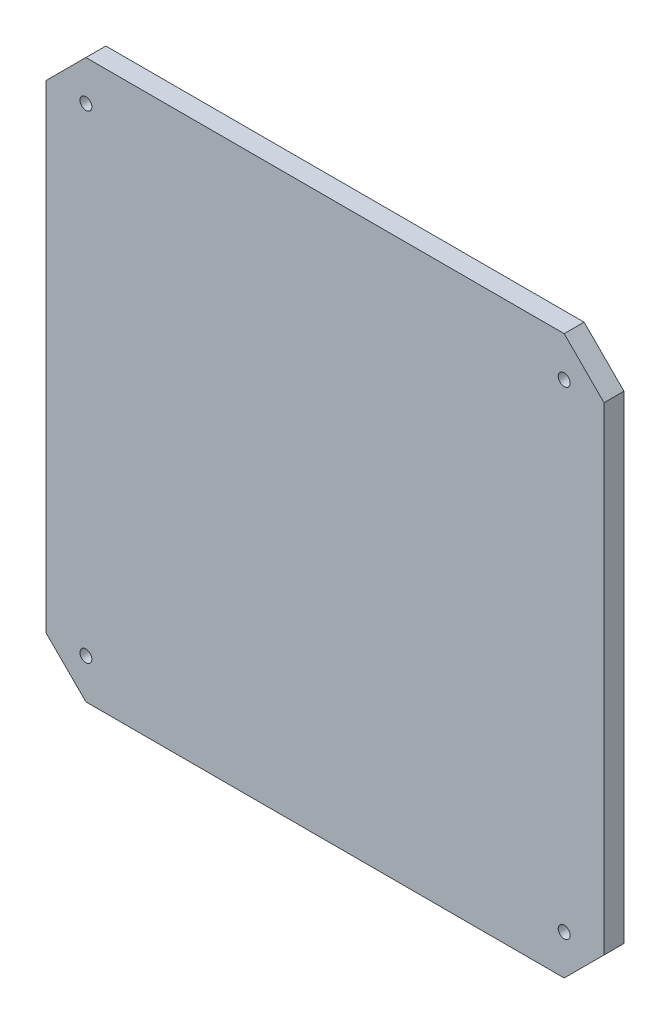
ISO-10303-21;
HEADER;
FILE_DESCRIPTION(('STEP AP214'),'2;1');
FILE_NAME('part.step','',(''),(''),'','','');
FILE_SCHEMA(('AUTOMOTIVE_DESIGN { 1 0 10303 214 1 1 1 1 }'));
ENDSEC;
DATA;
#1=APPLICATION_CONTEXT('core data for automotive mechanical design processes');
#2=APPLICATION_PROTOCOL_DEFINITION('international standard','automotive_design',2000,#1);
#3=PRODUCT_CONTEXT('',#1,'mechanical');
#4=PRODUCT('Part','Part','',(#3));
#5=PRODUCT_RELATED_PRODUCT_CATEGORY('part','',(#4));
#6=PRODUCT_DEFINITION_FORMATION('','',#4);
#7=PRODUCT_DEFINITION_CONTEXT('part definition',#1,'design');
#8=PRODUCT_DEFINITION('design','',#6,#7);
#9=PRODUCT_DEFINITION_SHAPE('','',#8);
#10=(LENGTH_UNIT() NAMED_UNIT(*) SI_UNIT(.MILLI.,.METRE.));
#11=(NAMED_UNIT(*) PLANE_ANGLE_UNIT() SI_UNIT($,.RADIAN.));
#12=(NAMED_UNIT(*) SI_UNIT($,.STERADIAN.) SOLID_ANGLE_UNIT());
#13=UNCERTAINTY_MEASURE_WITH_UNIT(LENGTH_MEASURE(1.E-05),#10,'distance_accuracy_value','');
#14=(GEOMETRIC_REPRESENTATION_CONTEXT(3) GLOBAL_UNCERTAINTY_ASSIGNED_CONTEXT((#13)) GLOBAL_UNIT_ASSIGNED_CONTEXT((#10,
#11,#12)) REPRESENTATION_CONTEXT('',''));
#15=CARTESIAN_POINT('',(0.,0.,0.));
#16=DIRECTION('',(0.,0.,1.));
#17=DIRECTION('',(1.,0.,0.));
#18=AXIS2_PLACEMENT_3D('',#15,#16,#17);
#19=CARTESIAN_POINT('',(0.,0.,12.7));
#20=DIRECTION('',(0.,0.,-1.));
#21=DIRECTION('',(-1.,0.,0.));
#22=AXIS2_PLACEMENT_3D('',#19,#20,#21);
#23=PLANE('',#22);
#24=DIRECTION('',(-1.,0.,0.));
#25=VECTOR('',#24,1.);
#26=CARTESIAN_POINT('',(-152.4,177.8,12.7));
#27=LINE('',#26,#25);
#28=CARTESIAN_POINT('',(152.4,177.8,12.7));
#29=VERTEX_POINT('',#28);
#30=CARTESIAN_POINT('',(-152.4,177.8,12.7));
#31=VERTEX_POINT('',#30);
#32=EDGE_CURVE('E153',#29,#31,#27,.T.);
#33=ORIENTED_EDGE('',*,*,#32,.T.);
#34=DIRECTION('',(-0.707106781186547,-0.707106781186548,0.));
#35=VECTOR('',#34,1.);
#36=CARTESIAN_POINT('',(-177.8,152.4,12.7));
#37=LINE('',#36,#35);
#38=CARTESIAN_POINT('',(-177.8,152.4,12.7));
#39=VERTEX_POINT('',#38);
#40=EDGE_CURVE('E102',#31,#39,#37,.T.);
#41=ORIENTED_EDGE('',*,*,#40,.T.);
#42=DIRECTION('',(0.,-1.,0.));
#43=VECTOR('',#42,1.);
#44=CARTESIAN_POINT('',(-177.8,152.4,12.7));
#45=LINE('',#44,#43);
#46=CARTESIAN_POINT('',(-177.8,-152.4,12.7));
#47=VERTEX_POINT('',#46);
#48=EDGE_CURVE('E166',#39,#47,#45,.T.);
#49=ORIENTED_EDGE('',*,*,#48,.T.);
#50=DIRECTION('',(0.707106781186547,-0.707106781186548,0.));
#51=VECTOR('',#50,1.);
#52=CARTESIAN_POINT('',(-177.8,-152.4,12.7));
#53=LINE('',#52,#51);
#54=CARTESIAN_POINT('',(-152.4,-177.8,12.7));
#55=VERTEX_POINT('',#54);
#56=EDGE_CURVE('E181',#47,#55,#53,.T.);
#57=ORIENTED_EDGE('',*,*,#56,.T.);
#58=DIRECTION('',(1.,0.,0.));
#59=VECTOR('',#58,1.);
#60=CARTESIAN_POINT('',(-152.4,-177.8,12.7));
#61=LINE('',#60,#59);
#62=CARTESIAN_POINT('',(152.4,-177.8,12.7));
#63=VERTEX_POINT('',#62);
#64=EDGE_CURVE('E116',#55,#63,#61,.T.);
#65=ORIENTED_EDGE('',*,*,#64,.T.);
#66=DIRECTION('',(0.707106781186547,0.707106781186548,0.));
#67=VECTOR('',#66,1.);
#68=CARTESIAN_POINT('',(152.4,-177.8,12.7));
#69=LINE('',#68,#67);
#70=CARTESIAN_POINT('',(177.8,-152.4,12.7));
#71=VERTEX_POINT('',#70);
#72=EDGE_CURVE('E114',#63,#71,#69,.T.);
#73=ORIENTED_EDGE('',*,*,#72,.T.);
#74=DIRECTION('',(0.,1.,0.));
#75=VECTOR('',#74,1.);
#76=CARTESIAN_POINT('',(177.8,152.4,12.7));
#77=LINE('',#76,#75);
#78=CARTESIAN_POINT('',(177.8,152.4,12.7));
#79=VERTEX_POINT('',#78);
#80=EDGE_CURVE('E118',#71,#79,#77,.T.);
#81=ORIENTED_EDGE('',*,*,#80,.T.);
#82=DIRECTION('',(-0.707106781186547,0.707106781186548,0.));
#83=VECTOR('',#82,1.);
#84=CARTESIAN_POINT('',(152.4,177.8,12.7));
#85=LINE('',#84,#83);
#86=EDGE_CURVE('E59',#79,#29,#85,.T.);
#87=ORIENTED_EDGE('',*,*,#86,.T.);
#88=EDGE_LOOP('',(#33,#41,#49,#57,#65,#73,#81,#87));
#89=FACE_BOUND('',#88,.T.);
#90=CARTESIAN_POINT('',(-152.4,152.4,12.7));
#91=DIRECTION('',(0.,0.,1.));
#92=DIRECTION('',(1.,0.,0.));
#93=AXIS2_PLACEMENT_3D('',#90,#91,#92);
#94=CIRCLE('',#93,3.81000000000002);
#95=CARTESIAN_POINT('',(-148.59,152.4,12.7));
#96=VERTEX_POINT('',#95);
#97=EDGE_CURVE('E145',#96,#96,#94,.T.);
#98=ORIENTED_EDGE('',*,*,#97,.F.);
#99=EDGE_LOOP('',(#98));
#100=FACE_BOUND('',#99,.T.);
#101=CARTESIAN_POINT('',(152.4,152.4,12.7));
#102=DIRECTION('',(0.,0.,1.));
#103=DIRECTION('',(1.,0.,0.));
#104=AXIS2_PLACEMENT_3D('',#101,#102,#103);
#105=CIRCLE('',#104,3.81000000000002);
#106=CARTESIAN_POINT('',(156.21,152.4,12.7));
#107=VERTEX_POINT('',#106);
#108=EDGE_CURVE('E189',#107,#107,#105,.T.);
#109=ORIENTED_EDGE('',*,*,#108,.F.);
#110=EDGE_LOOP('',(#109));
#111=FACE_BOUND('',#110,.T.);
#112=CARTESIAN_POINT('',(152.4,-152.4,12.7));
#113=DIRECTION('',(0.,0.,1.));
#114=DIRECTION('',(1.,0.,0.));
#115=AXIS2_PLACEMENT_3D('',#112,#113,#114);
#116=CIRCLE('',#115,3.81000000000002);
#117=CARTESIAN_POINT('',(156.21,-152.4,12.7));
#118=VERTEX_POINT('',#117);
#119=EDGE_CURVE('E197',#118,#118,#116,.T.);
#120=ORIENTED_EDGE('',*,*,#119,.F.);
#121=EDGE_LOOP('',(#120));
#122=FACE_BOUND('',#121,.T.);
#123=CARTESIAN_POINT('',(-152.4,-152.4,12.7));
#124=DIRECTION('',(0.,0.,1.));
#125=DIRECTION('',(1.,0.,0.));
#126=AXIS2_PLACEMENT_3D('',#123,#124,#125);
#127=CIRCLE('',#126,3.81000000000002);
#128=CARTESIAN_POINT('',(-148.59,-152.4,12.7));
#129=VERTEX_POINT('',#128);
#130=EDGE_CURVE('E205',#129,#129,#127,.T.);
#131=ORIENTED_EDGE('',*,*,#130,.F.);
#132=EDGE_LOOP('',(#131));
#133=FACE_BOUND('',#132,.T.);
#134=ADVANCED_FACE('F41',(#89,#100,#111,#122,#133),#23,.F.);
#135=CARTESIAN_POINT('',(0.,0.,0.));
#136=DIRECTION('',(0.,0.,-1.));
#137=DIRECTION('',(-1.,0.,0.));
#138=AXIS2_PLACEMENT_3D('',#135,#136,#137);
#139=PLANE('',#138);
#140=CARTESIAN_POINT('',(152.4,-152.4,0.));
#141=DIRECTION('',(0.,0.,1.));
#142=DIRECTION('',(1.,0.,0.));
#143=AXIS2_PLACEMENT_3D('',#140,#141,#142);
#144=CIRCLE('',#143,3.81000000000002);
#145=CARTESIAN_POINT('',(156.21,-152.4,0.));
#146=VERTEX_POINT('',#145);
#147=EDGE_CURVE('E199',#146,#146,#144,.T.);
#148=ORIENTED_EDGE('',*,*,#147,.T.);
#149=EDGE_LOOP('',(#148));
#150=FACE_BOUND('',#149,.T.);
#151=CARTESIAN_POINT('',(-152.4,152.4,0.));
#152=DIRECTION('',(0.,0.,1.));
#153=DIRECTION('',(1.,0.,0.));
#154=AXIS2_PLACEMENT_3D('',#151,#152,#153);
#155=CIRCLE('',#154,3.81000000000002);
#156=CARTESIAN_POINT('',(-148.59,152.4,0.));
#157=VERTEX_POINT('',#156);
#158=EDGE_CURVE('E190',#157,#157,#155,.T.);
#159=ORIENTED_EDGE('',*,*,#158,.T.);
#160=EDGE_LOOP('',(#159));
#161=FACE_BOUND('',#160,.T.);
#162=DIRECTION('',(-1.,0.,0.));
#163=VECTOR('',#162,1.);
#164=CARTESIAN_POINT('',(-152.4,177.8,0.));
#165=LINE('',#164,#163);
#166=CARTESIAN_POINT('',(152.4,177.8,0.));
#167=VERTEX_POINT('',#166);
#168=CARTESIAN_POINT('',(-152.4,177.8,0.));
#169=VERTEX_POINT('',#168);
#170=EDGE_CURVE('E138',#167,#169,#165,.T.);
#171=ORIENTED_EDGE('',*,*,#170,.F.);
#172=DIRECTION('',(-0.707106781186547,0.707106781186548,0.));
#173=VECTOR('',#172,1.);
#174=CARTESIAN_POINT('',(152.4,177.8,0.));
#175=LINE('',#174,#173);
#176=CARTESIAN_POINT('',(177.8,152.4,0.));
#177=VERTEX_POINT('',#176);
#178=EDGE_CURVE('E93',#177,#167,#175,.T.);
#179=ORIENTED_EDGE('',*,*,#178,.F.);
#180=DIRECTION('',(0.,1.,0.));
#181=VECTOR('',#180,1.);
#182=CARTESIAN_POINT('',(177.8,152.4,0.));
#183=LINE('',#182,#181);
#184=CARTESIAN_POINT('',(177.8,-152.4,0.));
#185=VERTEX_POINT('',#184);
#186=EDGE_CURVE('E90',#185,#177,#183,.T.);
#187=ORIENTED_EDGE('',*,*,#186,.F.);
#188=DIRECTION('',(0.707106781186547,0.707106781186548,0.));
#189=VECTOR('',#188,1.);
#190=CARTESIAN_POINT('',(152.4,-177.8,0.));
#191=LINE('',#190,#189);
#192=CARTESIAN_POINT('',(152.4,-177.8,0.));
#193=VERTEX_POINT('',#192);
#194=EDGE_CURVE('E126',#193,#185,#191,.T.);
#195=ORIENTED_EDGE('',*,*,#194,.F.);
#196=DIRECTION('',(1.,0.,0.));
#197=VECTOR('',#196,1.);
#198=CARTESIAN_POINT('',(-152.4,-177.8,0.));
#199=LINE('',#198,#197);
#200=CARTESIAN_POINT('',(-152.4,-177.8,0.));
#201=VERTEX_POINT('',#200);
#202=EDGE_CURVE('E149',#201,#193,#199,.T.);
#203=ORIENTED_EDGE('',*,*,#202,.F.);
#204=DIRECTION('',(0.707106781186547,-0.707106781186548,0.));
#205=VECTOR('',#204,1.);
#206=CARTESIAN_POINT('',(-177.8,-152.4,0.));
#207=LINE('',#206,#205);
#208=CARTESIAN_POINT('',(-177.8,-152.4,0.));
#209=VERTEX_POINT('',#208);
#210=EDGE_CURVE('E147',#209,#201,#207,.T.);
#211=ORIENTED_EDGE('',*,*,#210,.F.);
#212=DIRECTION('',(0.,-1.,0.));
#213=VECTOR('',#212,1.);
#214=CARTESIAN_POINT('',(-177.8,152.4,0.));
#215=LINE('',#214,#213);
#216=CARTESIAN_POINT('',(-177.8,152.4,0.));
#217=VERTEX_POINT('',#216);
#218=EDGE_CURVE('E143',#217,#209,#215,.T.);
#219=ORIENTED_EDGE('',*,*,#218,.F.);
#220=DIRECTION('',(-0.707106781186547,-0.707106781186548,0.));
#221=VECTOR('',#220,1.);
#222=CARTESIAN_POINT('',(-177.8,152.4,0.));
#223=LINE('',#222,#221);
#224=EDGE_CURVE('E141',#169,#217,#223,.T.);
#225=ORIENTED_EDGE('',*,*,#224,.F.);
#226=EDGE_LOOP('',(#171,#179,#187,#195,#203,#211,#219,#225));
#227=FACE_BOUND('',#226,.T.);
#228=CARTESIAN_POINT('',(152.4,152.4,0.));
#229=DIRECTION('',(0.,0.,1.));
#230=DIRECTION('',(1.,0.,0.));
#231=AXIS2_PLACEMENT_3D('',#228,#229,#230);
#232=CIRCLE('',#231,3.81000000000002);
#233=CARTESIAN_POINT('',(156.21,152.4,0.));
#234=VERTEX_POINT('',#233);
#235=EDGE_CURVE('E194',#234,#234,#232,.T.);
#236=ORIENTED_EDGE('',*,*,#235,.T.);
#237=EDGE_LOOP('',(#236));
#238=FACE_BOUND('',#237,.T.);
#239=CARTESIAN_POINT('',(-152.4,-152.4,0.));
#240=DIRECTION('',(0.,0.,1.));
#241=DIRECTION('',(1.,0.,0.));
#242=AXIS2_PLACEMENT_3D('',#239,#240,#241);
#243=CIRCLE('',#242,3.81000000000002);
#244=CARTESIAN_POINT('',(-148.59,-152.4,0.));
#245=VERTEX_POINT('',#244);
#246=EDGE_CURVE('E203',#245,#245,#243,.T.);
#247=ORIENTED_EDGE('',*,*,#246,.T.);
#248=EDGE_LOOP('',(#247));
#249=FACE_BOUND('',#248,.T.);
#250=ADVANCED_FACE('F175',(#150,#161,#227,#238,#249),#139,.T.);
#251=CARTESIAN_POINT('',(-152.4,177.8,12.7));
#252=DIRECTION('',(0.,-1.,0.));
#253=DIRECTION('',(0.,0.,-1.));
#254=AXIS2_PLACEMENT_3D('',#251,#252,#253);
#255=PLANE('',#254);
#256=ORIENTED_EDGE('',*,*,#170,.T.);
#257=DIRECTION('',(0.,0.,-1.));
#258=VECTOR('',#257,1.);
#259=CARTESIAN_POINT('',(-152.4,177.8,12.7));
#260=LINE('',#259,#258);
#261=EDGE_CURVE('E11',#31,#169,#260,.T.);
#262=ORIENTED_EDGE('',*,*,#261,.F.);
#263=ORIENTED_EDGE('',*,*,#32,.F.);
#264=DIRECTION('',(0.,0.,-1.));
#265=VECTOR('',#264,1.);
#266=CARTESIAN_POINT('',(152.4,177.8,12.7));
#267=LINE('',#266,#265);
#268=EDGE_CURVE('E132',#29,#167,#267,.T.);
#269=ORIENTED_EDGE('',*,*,#268,.T.);
#270=EDGE_LOOP('',(#256,#262,#263,#269));
#271=FACE_BOUND('',#270,.T.);
#272=ADVANCED_FACE('F43',(#271),#255,.F.);
#273=CARTESIAN_POINT('',(-177.8,152.4,12.7));
#274=DIRECTION('',(0.707106781186548,-0.707106781186547,0.));
#275=DIRECTION('',(0.707106781186547,0.707106781186548,0.));
#276=AXIS2_PLACEMENT_3D('',#273,#274,#275);
#277=PLANE('',#276);
#278=ORIENTED_EDGE('',*,*,#224,.T.);
#279=DIRECTION('',(0.,0.,-1.));
#280=VECTOR('',#279,1.);
#281=CARTESIAN_POINT('',(-177.8,152.4,12.7));
#282=LINE('',#281,#280);
#283=EDGE_CURVE('E49',#39,#217,#282,.T.);
#284=ORIENTED_EDGE('',*,*,#283,.F.);
#285=ORIENTED_EDGE('',*,*,#40,.F.);
#286=ORIENTED_EDGE('',*,*,#261,.T.);
#287=EDGE_LOOP('',(#278,#284,#285,#286));
#288=FACE_BOUND('',#287,.T.);
#289=ADVANCED_FACE('F240',(#288),#277,.F.);
#290=CARTESIAN_POINT('',(-177.8,152.4,12.7));
#291=DIRECTION('',(1.,0.,0.));
#292=DIRECTION('',(0.,1.,0.));
#293=AXIS2_PLACEMENT_3D('',#290,#291,#292);
#294=PLANE('',#293);
#295=ORIENTED_EDGE('',*,*,#218,.T.);
#296=DIRECTION('',(0.,0.,-1.));
#297=VECTOR('',#296,1.);
#298=CARTESIAN_POINT('',(-177.8,-152.4,12.7));
#299=LINE('',#298,#297);
#300=EDGE_CURVE('E158',#47,#209,#299,.T.);
#301=ORIENTED_EDGE('',*,*,#300,.F.);
#302=ORIENTED_EDGE('',*,*,#48,.F.);
#303=ORIENTED_EDGE('',*,*,#283,.T.);
#304=EDGE_LOOP('',(#295,#301,#302,#303));
#305=FACE_BOUND('',#304,.T.);
#306=ADVANCED_FACE('F168',(#305),#294,.F.);
#307=CARTESIAN_POINT('',(-177.8,-152.4,12.7));
#308=DIRECTION('',(0.707106781186548,0.707106781186547,0.));
#309=DIRECTION('',(-0.707106781186547,0.707106781186548,0.));
#310=AXIS2_PLACEMENT_3D('',#307,#308,#309);
#311=PLANE('',#310);
#312=ORIENTED_EDGE('',*,*,#210,.T.);
#313=DIRECTION('',(0.,0.,-1.));
#314=VECTOR('',#313,1.);
#315=CARTESIAN_POINT('',(-152.4,-177.8,12.7));
#316=LINE('',#315,#314);
#317=EDGE_CURVE('E160',#55,#201,#316,.T.);
#318=ORIENTED_EDGE('',*,*,#317,.F.);
#319=ORIENTED_EDGE('',*,*,#56,.F.);
#320=ORIENTED_EDGE('',*,*,#300,.T.);
#321=EDGE_LOOP('',(#312,#318,#319,#320));
#322=FACE_BOUND('',#321,.T.);
#323=ADVANCED_FACE('F180',(#322),#311,.F.);
#324=CARTESIAN_POINT('',(-152.4,-177.8,12.7));
#325=DIRECTION('',(0.,1.,0.));
#326=DIRECTION('',(0.,0.,1.));
#327=AXIS2_PLACEMENT_3D('',#324,#325,#326);
#328=PLANE('',#327);
#329=ORIENTED_EDGE('',*,*,#202,.T.);
#330=DIRECTION('',(0.,0.,-1.));
#331=VECTOR('',#330,1.);
#332=CARTESIAN_POINT('',(152.4,-177.8,12.7));
#333=LINE('',#332,#331);
#334=EDGE_CURVE('E129',#63,#193,#333,.T.);
#335=ORIENTED_EDGE('',*,*,#334,.F.);
#336=ORIENTED_EDGE('',*,*,#64,.F.);
#337=ORIENTED_EDGE('',*,*,#317,.T.);
#338=EDGE_LOOP('',(#329,#335,#336,#337));
#339=FACE_BOUND('',#338,.T.);
#340=ADVANCED_FACE('F179',(#339),#328,.F.);
#341=CARTESIAN_POINT('',(152.4,-177.8,12.7));
#342=DIRECTION('',(-0.707106781186548,0.707106781186547,0.));
#343=DIRECTION('',(-0.707106781186547,-0.707106781186548,0.));
#344=AXIS2_PLACEMENT_3D('',#341,#342,#343);
#345=PLANE('',#344);
#346=ORIENTED_EDGE('',*,*,#194,.T.);
#347=DIRECTION('',(0.,0.,-1.));
#348=VECTOR('',#347,1.);
#349=CARTESIAN_POINT('',(177.8,-152.4,12.7));
#350=LINE('',#349,#348);
#351=EDGE_CURVE('E124',#71,#185,#350,.T.);
#352=ORIENTED_EDGE('',*,*,#351,.F.);
#353=ORIENTED_EDGE('',*,*,#72,.F.);
#354=ORIENTED_EDGE('',*,*,#334,.T.);
#355=EDGE_LOOP('',(#346,#352,#353,#354));
#356=FACE_BOUND('',#355,.T.);
#357=ADVANCED_FACE('F128',(#356),#345,.F.);
#358=CARTESIAN_POINT('',(177.8,152.4,12.7));
#359=DIRECTION('',(-1.,0.,0.));
#360=DIRECTION('',(0.,0.,1.));
#361=AXIS2_PLACEMENT_3D('',#358,#359,#360);
#362=PLANE('',#361);
#363=ORIENTED_EDGE('',*,*,#186,.T.);
#364=DIRECTION('',(0.,0.,-1.));
#365=VECTOR('',#364,1.);
#366=CARTESIAN_POINT('',(177.8,152.4,12.7));
#367=LINE('',#366,#365);
#368=EDGE_CURVE('E127',#79,#177,#367,.T.);
#369=ORIENTED_EDGE('',*,*,#368,.F.);
#370=ORIENTED_EDGE('',*,*,#80,.F.);
#371=ORIENTED_EDGE('',*,*,#351,.T.);
#372=EDGE_LOOP('',(#363,#369,#370,#371));
#373=FACE_BOUND('',#372,.T.);
#374=ADVANCED_FACE('F135',(#373),#362,.F.);
#375=CARTESIAN_POINT('',(152.4,177.8,12.7));
#376=DIRECTION('',(-0.707106781186548,-0.707106781186547,0.));
#377=DIRECTION('',(0.707106781186547,-0.707106781186548,0.));
#378=AXIS2_PLACEMENT_3D('',#375,#376,#377);
#379=PLANE('',#378);
#380=ORIENTED_EDGE('',*,*,#178,.T.);
#381=ORIENTED_EDGE('',*,*,#268,.F.);
#382=ORIENTED_EDGE('',*,*,#86,.F.);
#383=ORIENTED_EDGE('',*,*,#368,.T.);
#384=EDGE_LOOP('',(#380,#381,#382,#383));
#385=FACE_BOUND('',#384,.T.);
#386=ADVANCED_FACE('F224',(#385),#379,.F.);
#387=CARTESIAN_POINT('',(-152.4,152.4,12.7));
#388=DIRECTION('',(0.,0.,-1.));
#389=DIRECTION('',(-1.,0.,0.));
#390=AXIS2_PLACEMENT_3D('',#387,#388,#389);
#391=CYLINDRICAL_SURFACE('',#390,3.81000000000002);
#392=ORIENTED_EDGE('',*,*,#97,.T.);
#393=EDGE_LOOP('',(#392));
#394=FACE_BOUND('',#393,.T.);
#395=ORIENTED_EDGE('',*,*,#158,.F.);
#396=EDGE_LOOP('',(#395));
#397=FACE_BOUND('',#396,.T.);
#398=ADVANCED_FACE('F225',(#394,#397),#391,.F.);
#399=CARTESIAN_POINT('',(152.4,152.4,12.7));
#400=DIRECTION('',(0.,0.,-1.));
#401=DIRECTION('',(-1.,0.,0.));
#402=AXIS2_PLACEMENT_3D('',#399,#400,#401);
#403=CYLINDRICAL_SURFACE('',#402,3.81000000000002);
#404=ORIENTED_EDGE('',*,*,#108,.T.);
#405=EDGE_LOOP('',(#404));
#406=FACE_BOUND('',#405,.T.);
#407=ORIENTED_EDGE('',*,*,#235,.F.);
#408=EDGE_LOOP('',(#407));
#409=FACE_BOUND('',#408,.T.);
#410=ADVANCED_FACE('F296',(#406,#409),#403,.F.);
#411=CARTESIAN_POINT('',(152.4,-152.4,12.7));
#412=DIRECTION('',(0.,0.,-1.));
#413=DIRECTION('',(-1.,0.,0.));
#414=AXIS2_PLACEMENT_3D('',#411,#412,#413);
#415=CYLINDRICAL_SURFACE('',#414,3.81000000000002);
#416=ORIENTED_EDGE('',*,*,#119,.T.);
#417=EDGE_LOOP('',(#416));
#418=FACE_BOUND('',#417,.T.);
#419=ORIENTED_EDGE('',*,*,#147,.F.);
#420=EDGE_LOOP('',(#419));
#421=FACE_BOUND('',#420,.T.);
#422=ADVANCED_FACE('F306',(#418,#421),#415,.F.);
#423=CARTESIAN_POINT('',(-152.4,-152.4,12.7));
#424=DIRECTION('',(0.,0.,-1.));
#425=DIRECTION('',(-1.,0.,0.));
#426=AXIS2_PLACEMENT_3D('',#423,#424,#425);
#427=CYLINDRICAL_SURFACE('',#426,3.81000000000002);
#428=ORIENTED_EDGE('',*,*,#130,.T.);
#429=EDGE_LOOP('',(#428));
#430=FACE_BOUND('',#429,.T.);
#431=ORIENTED_EDGE('',*,*,#246,.F.);
#432=EDGE_LOOP('',(#431));
#433=FACE_BOUND('',#432,.T.);
#434=ADVANCED_FACE('F213',(#430,#433),#427,.F.);
#435=CLOSED_SHELL('',(#134,#250,#272,#289,#306,#323,#340,#357,#374,#386,#398,#410,#422,#434));
#436=MANIFOLD_SOLID_BREP('B2',#435);
#437=ADVANCED_BREP_SHAPE_REPRESENTATION('',(#18,#436),#14);
#438=SHAPE_DEFINITION_REPRESENTATION(#9,#437);
ENDSEC;
END-ISO-10303-21;
